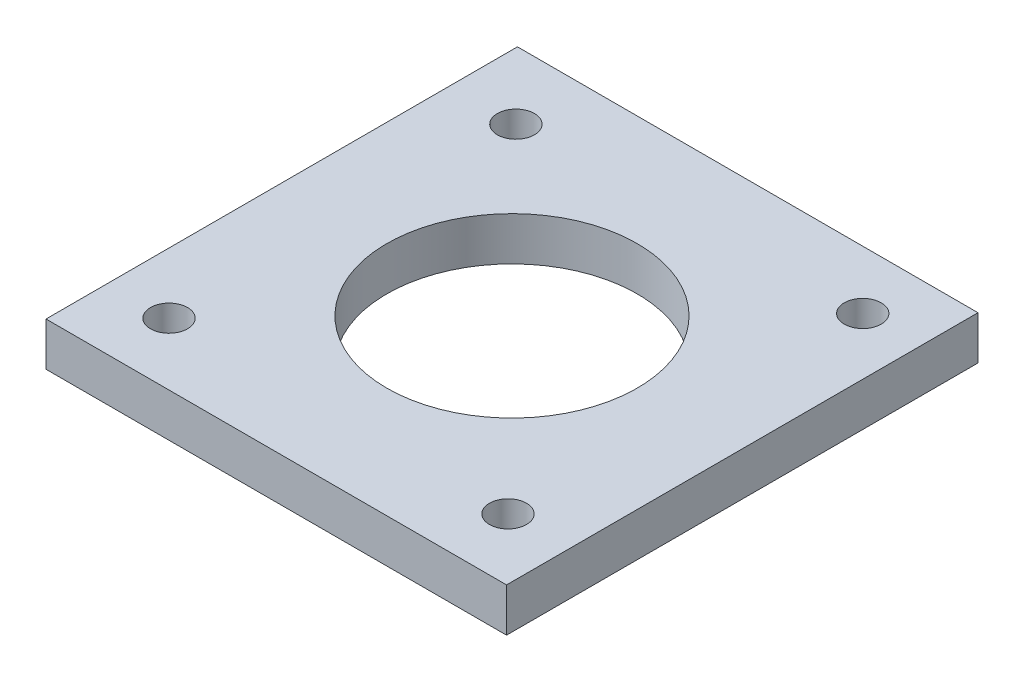
ISO-10303-21;
HEADER;
FILE_DESCRIPTION(('STEP AP214'),'2;1');
FILE_NAME('part.step','',(''),(''),'','','');
FILE_SCHEMA(('AUTOMOTIVE_DESIGN { 1 0 10303 214 1 1 1 1 }'));
ENDSEC;
DATA;
#1=APPLICATION_CONTEXT('core data for automotive mechanical design processes');
#2=APPLICATION_PROTOCOL_DEFINITION('international standard','automotive_design',2000,#1);
#3=PRODUCT_CONTEXT('',#1,'mechanical');
#4=PRODUCT('Part','Part','',(#3));
#5=PRODUCT_RELATED_PRODUCT_CATEGORY('part','',(#4));
#6=PRODUCT_DEFINITION_FORMATION('','',#4);
#7=PRODUCT_DEFINITION_CONTEXT('part definition',#1,'design');
#8=PRODUCT_DEFINITION('design','',#6,#7);
#9=PRODUCT_DEFINITION_SHAPE('','',#8);
#10=(LENGTH_UNIT() NAMED_UNIT(*) SI_UNIT(.MILLI.,.METRE.));
#11=(NAMED_UNIT(*) PLANE_ANGLE_UNIT() SI_UNIT($,.RADIAN.));
#12=(NAMED_UNIT(*) SI_UNIT($,.STERADIAN.) SOLID_ANGLE_UNIT());
#13=UNCERTAINTY_MEASURE_WITH_UNIT(LENGTH_MEASURE(1.E-05),#10,'distance_accuracy_value','');
#14=(GEOMETRIC_REPRESENTATION_CONTEXT(3) GLOBAL_UNCERTAINTY_ASSIGNED_CONTEXT((#13)) GLOBAL_UNIT_ASSIGNED_CONTEXT((#10,
#11,#12)) REPRESENTATION_CONTEXT('',''));
#15=CARTESIAN_POINT('',(0.,0.,0.));
#16=DIRECTION('',(0.,0.,1.));
#17=DIRECTION('',(1.,0.,0.));
#18=AXIS2_PLACEMENT_3D('',#15,#16,#17);
#19=CARTESIAN_POINT('',(0.,4.,0.));
#20=DIRECTION('',(0.,-1.,0.));
#21=DIRECTION('',(0.,0.,-1.));
#22=AXIS2_PLACEMENT_3D('',#19,#20,#21);
#23=PLANE('',#22);
#24=DIRECTION('',(0.,0.,-1.));
#25=VECTOR('',#24,1.);
#26=CARTESIAN_POINT('',(21.15,4.,21.65));
#27=LINE('',#26,#25);
#28=CARTESIAN_POINT('',(21.15,4.,21.65));
#29=VERTEX_POINT('',#28);
#30=CARTESIAN_POINT('',(21.15,4.,-21.65));
#31=VERTEX_POINT('',#30);
#32=EDGE_CURVE('E92',#29,#31,#27,.T.);
#33=ORIENTED_EDGE('',*,*,#32,.T.);
#34=DIRECTION('',(-1.,0.,0.));
#35=VECTOR('',#34,1.);
#36=CARTESIAN_POINT('',(-21.15,4.,-21.65));
#37=LINE('',#36,#35);
#38=CARTESIAN_POINT('',(-21.15,4.,-21.65));
#39=VERTEX_POINT('',#38);
#40=EDGE_CURVE('E89',#31,#39,#37,.T.);
#41=ORIENTED_EDGE('',*,*,#40,.T.);
#42=DIRECTION('',(0.,0.,1.));
#43=VECTOR('',#42,1.);
#44=CARTESIAN_POINT('',(-21.15,4.,21.65));
#45=LINE('',#44,#43);
#46=CARTESIAN_POINT('',(-21.15,4.,21.65));
#47=VERTEX_POINT('',#46);
#48=EDGE_CURVE('E91',#39,#47,#45,.T.);
#49=ORIENTED_EDGE('',*,*,#48,.T.);
#50=DIRECTION('',(1.,0.,0.));
#51=VECTOR('',#50,1.);
#52=CARTESIAN_POINT('',(-21.15,4.,21.65));
#53=LINE('',#52,#51);
#54=EDGE_CURVE('E58',#47,#29,#53,.T.);
#55=ORIENTED_EDGE('',*,*,#54,.T.);
#56=EDGE_LOOP('',(#33,#41,#49,#55));
#57=FACE_BOUND('',#56,.T.);
#58=CARTESIAN_POINT('',(-15.0693743627521,4.,-15.4256243476872));
#59=DIRECTION('',(0.,1.,0.));
#60=DIRECTION('',(0.,0.,1.));
#61=AXIS2_PLACEMENT_3D('',#58,#59,#60);
#62=CIRCLE('',#61,1.7);
#63=CARTESIAN_POINT('',(-15.0693743627521,4.,-13.7256243476872));
#64=VERTEX_POINT('',#63);
#65=EDGE_CURVE('E109',#64,#64,#62,.T.);
#66=ORIENTED_EDGE('',*,*,#65,.F.);
#67=EDGE_LOOP('',(#66));
#68=FACE_BOUND('',#67,.T.);
#69=CARTESIAN_POINT('',(15.9184393720292,4.,-16.2947618158124));
#70=DIRECTION('',(0.,1.,0.));
#71=DIRECTION('',(0.,0.,1.));
#72=AXIS2_PLACEMENT_3D('',#69,#70,#71);
#73=CIRCLE('',#72,1.7);
#74=CARTESIAN_POINT('',(15.9184393720292,4.,-14.5947618158124));
#75=VERTEX_POINT('',#74);
#76=EDGE_CURVE('E125',#75,#75,#73,.T.);
#77=ORIENTED_EDGE('',*,*,#76,.F.);
#78=EDGE_LOOP('',(#77));
#79=FACE_BOUND('',#78,.T.);
#80=CARTESIAN_POINT('',(15.5663856712265,4.,15.9343853324848));
#81=DIRECTION('',(0.,1.,0.));
#82=DIRECTION('',(0.,0.,1.));
#83=AXIS2_PLACEMENT_3D('',#80,#81,#82);
#84=CIRCLE('',#83,1.7);
#85=CARTESIAN_POINT('',(15.5663856712265,4.,17.6343853324848));
#86=VERTEX_POINT('',#85);
#87=EDGE_CURVE('E132',#86,#86,#84,.T.);
#88=ORIENTED_EDGE('',*,*,#87,.F.);
#89=EDGE_LOOP('',(#88));
#90=FACE_BOUND('',#89,.T.);
#91=CARTESIAN_POINT('',(-15.5663856712265,4.,15.9343853324848));
#92=DIRECTION('',(0.,1.,0.));
#93=DIRECTION('',(0.,0.,1.));
#94=AXIS2_PLACEMENT_3D('',#91,#92,#93);
#95=CIRCLE('',#94,1.7);
#96=CARTESIAN_POINT('',(-15.5663856712265,4.,17.6343853324848));
#97=VERTEX_POINT('',#96);
#98=EDGE_CURVE('E137',#97,#97,#95,.T.);
#99=ORIENTED_EDGE('',*,*,#98,.F.);
#100=EDGE_LOOP('',(#99));
#101=FACE_BOUND('',#100,.T.);
#102=CARTESIAN_POINT('',(0.,4.,0.));
#103=DIRECTION('',(0.,1.,0.));
#104=DIRECTION('',(0.,0.,1.));
#105=AXIS2_PLACEMENT_3D('',#102,#103,#104);
#106=CIRCLE('',#105,11.5);
#107=CARTESIAN_POINT('',(0.,4.,11.5));
#108=VERTEX_POINT('',#107);
#109=EDGE_CURVE('E141',#108,#108,#106,.T.);
#110=ORIENTED_EDGE('',*,*,#109,.F.);
#111=EDGE_LOOP('',(#110));
#112=FACE_BOUND('',#111,.T.);
#113=ADVANCED_FACE('F43',(#57,#68,#79,#90,#101,#112),#23,.F.);
#114=CARTESIAN_POINT('',(0.,0.,0.));
#115=DIRECTION('',(0.,-1.,0.));
#116=DIRECTION('',(0.,0.,-1.));
#117=AXIS2_PLACEMENT_3D('',#114,#115,#116);
#118=PLANE('',#117);
#119=CARTESIAN_POINT('',(-15.5663856712265,0.,15.9343853324848));
#120=DIRECTION('',(0.,1.,0.));
#121=DIRECTION('',(0.,0.,1.));
#122=AXIS2_PLACEMENT_3D('',#119,#120,#121);
#123=CIRCLE('',#122,1.7);
#124=CARTESIAN_POINT('',(-15.5663856712265,0.,17.6343853324848));
#125=VERTEX_POINT('',#124);
#126=EDGE_CURVE('E140',#125,#125,#123,.T.);
#127=ORIENTED_EDGE('',*,*,#126,.T.);
#128=EDGE_LOOP('',(#127));
#129=FACE_BOUND('',#128,.T.);
#130=CARTESIAN_POINT('',(15.9184393720292,0.,-16.2947618158124));
#131=DIRECTION('',(0.,1.,0.));
#132=DIRECTION('',(0.,0.,1.));
#133=AXIS2_PLACEMENT_3D('',#130,#131,#132);
#134=CIRCLE('',#133,1.7);
#135=CARTESIAN_POINT('',(15.9184393720292,0.,-14.5947618158124));
#136=VERTEX_POINT('',#135);
#137=EDGE_CURVE('E126',#136,#136,#134,.T.);
#138=ORIENTED_EDGE('',*,*,#137,.T.);
#139=EDGE_LOOP('',(#138));
#140=FACE_BOUND('',#139,.T.);
#141=DIRECTION('',(0.,0.,-1.));
#142=VECTOR('',#141,1.);
#143=CARTESIAN_POINT('',(21.15,0.,21.65));
#144=LINE('',#143,#142);
#145=CARTESIAN_POINT('',(21.15,0.,21.65));
#146=VERTEX_POINT('',#145);
#147=CARTESIAN_POINT('',(21.15,0.,-21.65));
#148=VERTEX_POINT('',#147);
#149=EDGE_CURVE('E110',#146,#148,#144,.T.);
#150=ORIENTED_EDGE('',*,*,#149,.F.);
#151=DIRECTION('',(1.,0.,0.));
#152=VECTOR('',#151,1.);
#153=CARTESIAN_POINT('',(-21.15,0.,21.65));
#154=LINE('',#153,#152);
#155=CARTESIAN_POINT('',(-21.15,0.,21.65));
#156=VERTEX_POINT('',#155);
#157=EDGE_CURVE('E84',#156,#146,#154,.T.);
#158=ORIENTED_EDGE('',*,*,#157,.F.);
#159=DIRECTION('',(0.,0.,1.));
#160=VECTOR('',#159,1.);
#161=CARTESIAN_POINT('',(-21.15,0.,21.65));
#162=LINE('',#161,#160);
#163=CARTESIAN_POINT('',(-21.15,0.,-21.65));
#164=VERTEX_POINT('',#163);
#165=EDGE_CURVE('E80',#164,#156,#162,.T.);
#166=ORIENTED_EDGE('',*,*,#165,.F.);
#167=DIRECTION('',(-1.,0.,0.));
#168=VECTOR('',#167,1.);
#169=CARTESIAN_POINT('',(-21.15,0.,-21.65));
#170=LINE('',#169,#168);
#171=EDGE_CURVE('E97',#148,#164,#170,.T.);
#172=ORIENTED_EDGE('',*,*,#171,.F.);
#173=EDGE_LOOP('',(#150,#158,#166,#172));
#174=FACE_BOUND('',#173,.T.);
#175=CARTESIAN_POINT('',(-15.0693743627521,0.,-15.4256243476872));
#176=DIRECTION('',(0.,1.,0.));
#177=DIRECTION('',(0.,0.,1.));
#178=AXIS2_PLACEMENT_3D('',#175,#176,#177);
#179=CIRCLE('',#178,1.7);
#180=CARTESIAN_POINT('',(-15.0693743627521,0.,-13.7256243476872));
#181=VERTEX_POINT('',#180);
#182=EDGE_CURVE('E122',#181,#181,#179,.T.);
#183=ORIENTED_EDGE('',*,*,#182,.T.);
#184=EDGE_LOOP('',(#183));
#185=FACE_BOUND('',#184,.T.);
#186=CARTESIAN_POINT('',(15.5663856712265,0.,15.9343853324848));
#187=DIRECTION('',(0.,1.,0.));
#188=DIRECTION('',(0.,0.,1.));
#189=AXIS2_PLACEMENT_3D('',#186,#187,#188);
#190=CIRCLE('',#189,1.7);
#191=CARTESIAN_POINT('',(15.5663856712265,0.,17.6343853324848));
#192=VERTEX_POINT('',#191);
#193=EDGE_CURVE('E131',#192,#192,#190,.T.);
#194=ORIENTED_EDGE('',*,*,#193,.T.);
#195=EDGE_LOOP('',(#194));
#196=FACE_BOUND('',#195,.T.);
#197=CARTESIAN_POINT('',(0.,0.,0.));
#198=DIRECTION('',(0.,1.,0.));
#199=DIRECTION('',(0.,0.,1.));
#200=AXIS2_PLACEMENT_3D('',#197,#198,#199);
#201=CIRCLE('',#200,11.5);
#202=CARTESIAN_POINT('',(0.,0.,11.5));
#203=VERTEX_POINT('',#202);
#204=EDGE_CURVE('E148',#203,#203,#201,.T.);
#205=ORIENTED_EDGE('',*,*,#204,.T.);
#206=EDGE_LOOP('',(#205));
#207=FACE_BOUND('',#206,.T.);
#208=ADVANCED_FACE('F119',(#129,#140,#174,#185,#196,#207),#118,.T.);
#209=CARTESIAN_POINT('',(21.15,4.,21.65));
#210=DIRECTION('',(-1.,0.,0.));
#211=DIRECTION('',(0.,0.,1.));
#212=AXIS2_PLACEMENT_3D('',#209,#210,#211);
#213=PLANE('',#212);
#214=ORIENTED_EDGE('',*,*,#149,.T.);
#215=DIRECTION('',(0.,-1.,0.));
#216=VECTOR('',#215,1.);
#217=CARTESIAN_POINT('',(21.15,4.,-21.65));
#218=LINE('',#217,#216);
#219=EDGE_CURVE('E11',#31,#148,#218,.T.);
#220=ORIENTED_EDGE('',*,*,#219,.F.);
#221=ORIENTED_EDGE('',*,*,#32,.F.);
#222=DIRECTION('',(0.,-1.,0.));
#223=VECTOR('',#222,1.);
#224=CARTESIAN_POINT('',(21.15,4.,21.65));
#225=LINE('',#224,#223);
#226=EDGE_CURVE('E103',#29,#146,#225,.T.);
#227=ORIENTED_EDGE('',*,*,#226,.T.);
#228=EDGE_LOOP('',(#214,#220,#221,#227));
#229=FACE_BOUND('',#228,.T.);
#230=ADVANCED_FACE('F44',(#229),#213,.F.);
#231=CARTESIAN_POINT('',(-21.15,4.,-21.65));
#232=DIRECTION('',(0.,0.,1.));
#233=DIRECTION('',(1.,0.,0.));
#234=AXIS2_PLACEMENT_3D('',#231,#232,#233);
#235=PLANE('',#234);
#236=ORIENTED_EDGE('',*,*,#171,.T.);
#237=DIRECTION('',(0.,-1.,0.));
#238=VECTOR('',#237,1.);
#239=CARTESIAN_POINT('',(-21.15,4.,-21.65));
#240=LINE('',#239,#238);
#241=EDGE_CURVE('E55',#39,#164,#240,.T.);
#242=ORIENTED_EDGE('',*,*,#241,.F.);
#243=ORIENTED_EDGE('',*,*,#40,.F.);
#244=ORIENTED_EDGE('',*,*,#219,.T.);
#245=EDGE_LOOP('',(#236,#242,#243,#244));
#246=FACE_BOUND('',#245,.T.);
#247=ADVANCED_FACE('F98',(#246),#235,.F.);
#248=CARTESIAN_POINT('',(-21.15,4.,21.65));
#249=DIRECTION('',(1.,0.,0.));
#250=DIRECTION('',(0.,0.,-1.));
#251=AXIS2_PLACEMENT_3D('',#248,#249,#250);
#252=PLANE('',#251);
#253=ORIENTED_EDGE('',*,*,#165,.T.);
#254=DIRECTION('',(0.,-1.,0.));
#255=VECTOR('',#254,1.);
#256=CARTESIAN_POINT('',(-21.15,4.,21.65));
#257=LINE('',#256,#255);
#258=EDGE_CURVE('E99',#47,#156,#257,.T.);
#259=ORIENTED_EDGE('',*,*,#258,.F.);
#260=ORIENTED_EDGE('',*,*,#48,.F.);
#261=ORIENTED_EDGE('',*,*,#241,.T.);
#262=EDGE_LOOP('',(#253,#259,#260,#261));
#263=FACE_BOUND('',#262,.T.);
#264=ADVANCED_FACE('F101',(#263),#252,.F.);
#265=CARTESIAN_POINT('',(-21.15,4.,21.65));
#266=DIRECTION('',(0.,0.,-1.));
#267=DIRECTION('',(-1.,0.,0.));
#268=AXIS2_PLACEMENT_3D('',#265,#266,#267);
#269=PLANE('',#268);
#270=ORIENTED_EDGE('',*,*,#157,.T.);
#271=ORIENTED_EDGE('',*,*,#226,.F.);
#272=ORIENTED_EDGE('',*,*,#54,.F.);
#273=ORIENTED_EDGE('',*,*,#258,.T.);
#274=EDGE_LOOP('',(#270,#271,#272,#273));
#275=FACE_BOUND('',#274,.T.);
#276=ADVANCED_FACE('F113',(#275),#269,.F.);
#277=CARTESIAN_POINT('',(-15.0693743627521,4.,-15.4256243476872));
#278=DIRECTION('',(0.,-1.,0.));
#279=DIRECTION('',(0.,0.,-1.));
#280=AXIS2_PLACEMENT_3D('',#277,#278,#279);
#281=CYLINDRICAL_SURFACE('',#280,1.7);
#282=ORIENTED_EDGE('',*,*,#65,.T.);
#283=EDGE_LOOP('',(#282));
#284=FACE_BOUND('',#283,.T.);
#285=ORIENTED_EDGE('',*,*,#182,.F.);
#286=EDGE_LOOP('',(#285));
#287=FACE_BOUND('',#286,.T.);
#288=ADVANCED_FACE('F162',(#284,#287),#281,.F.);
#289=CARTESIAN_POINT('',(15.9184393720292,4.,-16.2947618158124));
#290=DIRECTION('',(0.,-1.,0.));
#291=DIRECTION('',(0.,0.,-1.));
#292=AXIS2_PLACEMENT_3D('',#289,#290,#291);
#293=CYLINDRICAL_SURFACE('',#292,1.7);
#294=ORIENTED_EDGE('',*,*,#76,.T.);
#295=EDGE_LOOP('',(#294));
#296=FACE_BOUND('',#295,.T.);
#297=ORIENTED_EDGE('',*,*,#137,.F.);
#298=EDGE_LOOP('',(#297));
#299=FACE_BOUND('',#298,.T.);
#300=ADVANCED_FACE('F208',(#296,#299),#293,.F.);
#301=CARTESIAN_POINT('',(15.5663856712265,4.,15.9343853324848));
#302=DIRECTION('',(0.,-1.,0.));
#303=DIRECTION('',(0.,0.,-1.));
#304=AXIS2_PLACEMENT_3D('',#301,#302,#303);
#305=CYLINDRICAL_SURFACE('',#304,1.7);
#306=ORIENTED_EDGE('',*,*,#87,.T.);
#307=EDGE_LOOP('',(#306));
#308=FACE_BOUND('',#307,.T.);
#309=ORIENTED_EDGE('',*,*,#193,.F.);
#310=EDGE_LOOP('',(#309));
#311=FACE_BOUND('',#310,.T.);
#312=ADVANCED_FACE('F216',(#308,#311),#305,.F.);
#313=CARTESIAN_POINT('',(-15.5663856712265,4.,15.9343853324848));
#314=DIRECTION('',(0.,-1.,0.));
#315=DIRECTION('',(0.,0.,-1.));
#316=AXIS2_PLACEMENT_3D('',#313,#314,#315);
#317=CYLINDRICAL_SURFACE('',#316,1.7);
#318=ORIENTED_EDGE('',*,*,#98,.T.);
#319=EDGE_LOOP('',(#318));
#320=FACE_BOUND('',#319,.T.);
#321=ORIENTED_EDGE('',*,*,#126,.F.);
#322=EDGE_LOOP('',(#321));
#323=FACE_BOUND('',#322,.T.);
#324=ADVANCED_FACE('F221',(#320,#323),#317,.F.);
#325=CARTESIAN_POINT('',(0.,4.,0.));
#326=DIRECTION('',(0.,-1.,0.));
#327=DIRECTION('',(0.,0.,-1.));
#328=AXIS2_PLACEMENT_3D('',#325,#326,#327);
#329=CYLINDRICAL_SURFACE('',#328,11.5);
#330=ORIENTED_EDGE('',*,*,#109,.T.);
#331=EDGE_LOOP('',(#330));
#332=FACE_BOUND('',#331,.T.);
#333=ORIENTED_EDGE('',*,*,#204,.F.);
#334=EDGE_LOOP('',(#333));
#335=FACE_BOUND('',#334,.T.);
#336=ADVANCED_FACE('F155',(#332,#335),#329,.F.);
#337=CLOSED_SHELL('',(#113,#208,#230,#247,#264,#276,#288,#300,#312,#324,#336));
#338=MANIFOLD_SOLID_BREP('B2',#337);
#339=ADVANCED_BREP_SHAPE_REPRESENTATION('',(#18,#338),#14);
#340=SHAPE_DEFINITION_REPRESENTATION(#9,#339);
ENDSEC;
END-ISO-10303-21;
